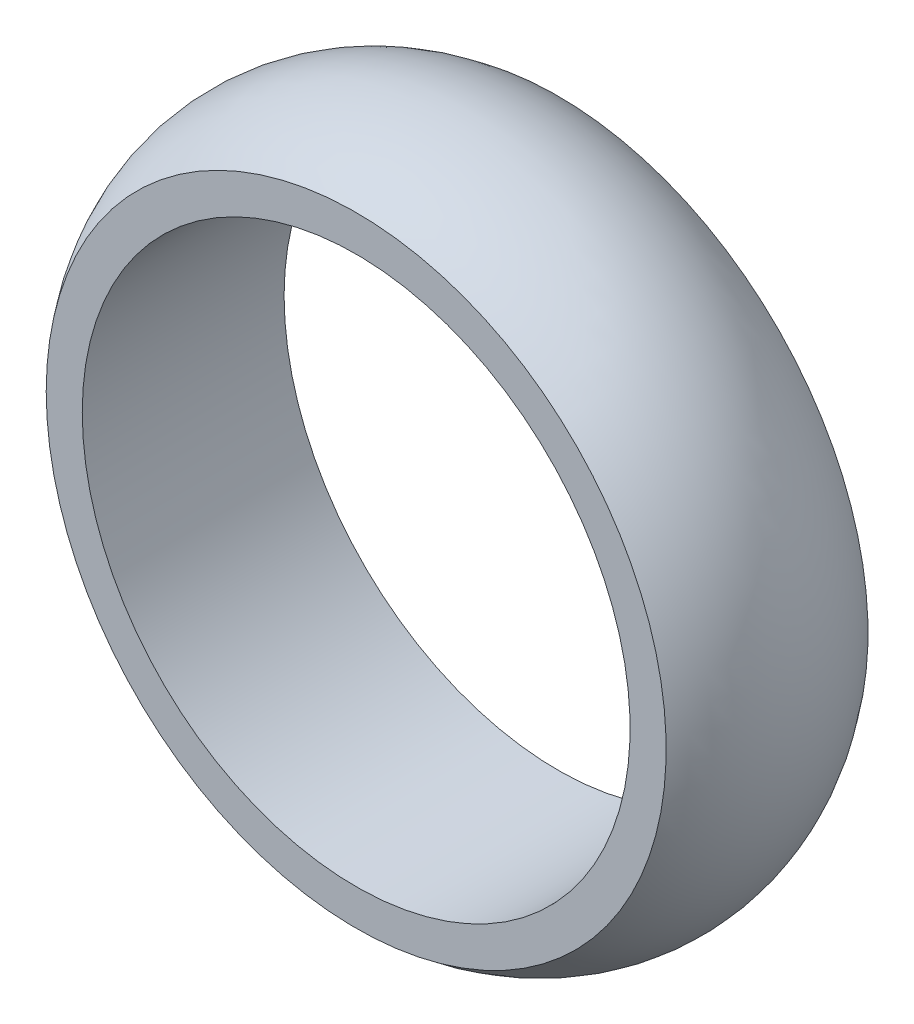
ISO-10303-21;
HEADER;
FILE_DESCRIPTION(('STEP AP214'),'2;1');
FILE_NAME('part.step','',(''),(''),'','','');
FILE_SCHEMA(('AUTOMOTIVE_DESIGN { 1 0 10303 214 1 1 1 1 }'));
ENDSEC;
DATA;
#1=APPLICATION_CONTEXT('core data for automotive mechanical design processes');
#2=APPLICATION_PROTOCOL_DEFINITION('international standard','automotive_design',2000,#1);
#3=PRODUCT_CONTEXT('',#1,'mechanical');
#4=PRODUCT('Part','Part','',(#3));
#5=PRODUCT_RELATED_PRODUCT_CATEGORY('part','',(#4));
#6=PRODUCT_DEFINITION_FORMATION('','',#4);
#7=PRODUCT_DEFINITION_CONTEXT('part definition',#1,'design');
#8=PRODUCT_DEFINITION('design','',#6,#7);
#9=PRODUCT_DEFINITION_SHAPE('','',#8);
#10=(LENGTH_UNIT() NAMED_UNIT(*) SI_UNIT(.MILLI.,.METRE.));
#11=(NAMED_UNIT(*) PLANE_ANGLE_UNIT() SI_UNIT($,.RADIAN.));
#12=(NAMED_UNIT(*) SI_UNIT($,.STERADIAN.) SOLID_ANGLE_UNIT());
#13=UNCERTAINTY_MEASURE_WITH_UNIT(LENGTH_MEASURE(1.E-05),#10,'distance_accuracy_value','');
#14=(GEOMETRIC_REPRESENTATION_CONTEXT(3) GLOBAL_UNCERTAINTY_ASSIGNED_CONTEXT((#13)) GLOBAL_UNIT_ASSIGNED_CONTEXT((#10,
#11,#12)) REPRESENTATION_CONTEXT('',''));
#15=CARTESIAN_POINT('',(0.,0.,0.));
#16=DIRECTION('',(0.,0.,1.));
#17=DIRECTION('',(1.,0.,0.));
#18=AXIS2_PLACEMENT_3D('',#15,#16,#17);
#19=CARTESIAN_POINT('',(0.,0.,-8.7081370001519));
#20=DIRECTION('',(0.,0.,-1.));
#21=DIRECTION('',(-1.,0.,0.));
#22=AXIS2_PLACEMENT_3D('',#19,#20,#21);
#23=CYLINDRICAL_SURFACE('',#22,9.5);
#24=CARTESIAN_POINT('',(0.,0.,-3.5));
#25=DIRECTION('',(0.,0.,-1.));
#26=DIRECTION('',(-1.,0.,0.));
#27=AXIS2_PLACEMENT_3D('',#24,#25,#26);
#28=CIRCLE('',#27,9.5);
#29=CARTESIAN_POINT('',(-9.5,0.,-3.5));
#30=VERTEX_POINT('',#29);
#31=EDGE_CURVE('E47',#30,#30,#28,.T.);
#32=ORIENTED_EDGE('',*,*,#31,.T.);
#33=EDGE_LOOP('',(#32));
#34=FACE_BOUND('',#33,.T.);
#35=CARTESIAN_POINT('',(0.,0.,3.5));
#36=DIRECTION('',(0.,0.,-1.));
#37=DIRECTION('',(-1.,0.,0.));
#38=AXIS2_PLACEMENT_3D('',#35,#36,#37);
#39=CIRCLE('',#38,9.5);
#40=CARTESIAN_POINT('',(-9.5,0.,3.5));
#41=VERTEX_POINT('',#40);
#42=EDGE_CURVE('E10',#41,#41,#39,.T.);
#43=ORIENTED_EDGE('',*,*,#42,.F.);
#44=EDGE_LOOP('',(#43));
#45=FACE_BOUND('',#44,.T.);
#46=ADVANCED_FACE('F33',(#34,#45),#23,.F.);
#47=CARTESIAN_POINT('',(-9.5,0.,3.5));
#48=DIRECTION('',(0.,0.,1.));
#49=DIRECTION('',(1.,0.,0.));
#50=AXIS2_PLACEMENT_3D('',#47,#48,#49);
#51=PLANE('',#50);
#52=ORIENTED_EDGE('',*,*,#42,.T.);
#53=EDGE_LOOP('',(#52));
#54=FACE_BOUND('',#53,.T.);
#55=CARTESIAN_POINT('',(0.,0.,3.5));
#56=DIRECTION('',(0.,0.,-1.));
#57=DIRECTION('',(-1.,0.,0.));
#58=AXIS2_PLACEMENT_3D('',#55,#56,#57);
#59=CIRCLE('',#58,10.75);
#60=CARTESIAN_POINT('',(-10.75,0.,3.5));
#61=VERTEX_POINT('',#60);
#62=EDGE_CURVE('E39',#61,#61,#59,.T.);
#63=ORIENTED_EDGE('',*,*,#62,.F.);
#64=EDGE_LOOP('',(#63));
#65=FACE_BOUND('',#64,.T.);
#66=ADVANCED_FACE('F63',(#54,#65),#51,.T.);
#67=CARTESIAN_POINT('',(0.,0.,0.));
#68=DIRECTION('',(0.,0.,-1.));
#69=DIRECTION('',(-1.,0.,0.));
#70=AXIS2_PLACEMENT_3D('',#67,#68,#69);
#71=TOROIDAL_SURFACE('',#70,6.475,5.525);
#72=ORIENTED_EDGE('',*,*,#62,.T.);
#73=EDGE_LOOP('',(#72));
#74=FACE_BOUND('',#73,.T.);
#75=CARTESIAN_POINT('',(0.,0.,-3.5));
#76=DIRECTION('',(0.,0.,-1.));
#77=DIRECTION('',(-1.,0.,0.));
#78=AXIS2_PLACEMENT_3D('',#75,#76,#77);
#79=CIRCLE('',#78,10.75);
#80=CARTESIAN_POINT('',(-10.75,0.,-3.5));
#81=VERTEX_POINT('',#80);
#82=EDGE_CURVE('E43',#81,#81,#79,.T.);
#83=ORIENTED_EDGE('',*,*,#82,.F.);
#84=EDGE_LOOP('',(#83));
#85=FACE_BOUND('',#84,.T.);
#86=ADVANCED_FACE('F57',(#74,#85),#71,.T.);
#87=CARTESIAN_POINT('',(-9.5,0.,-3.5));
#88=DIRECTION('',(0.,0.,-1.));
#89=DIRECTION('',(-1.,0.,0.));
#90=AXIS2_PLACEMENT_3D('',#87,#88,#89);
#91=PLANE('',#90);
#92=ORIENTED_EDGE('',*,*,#82,.T.);
#93=EDGE_LOOP('',(#92));
#94=FACE_BOUND('',#93,.T.);
#95=ORIENTED_EDGE('',*,*,#31,.F.);
#96=EDGE_LOOP('',(#95));
#97=FACE_BOUND('',#96,.T.);
#98=ADVANCED_FACE('F55',(#94,#97),#91,.T.);
#99=CLOSED_SHELL('',(#46,#66,#86,#98));
#100=MANIFOLD_SOLID_BREP('B2',#99);
#101=ADVANCED_BREP_SHAPE_REPRESENTATION('',(#18,#100),#14);
#102=SHAPE_DEFINITION_REPRESENTATION(#9,#101);
ENDSEC;
END-ISO-10303-21;
